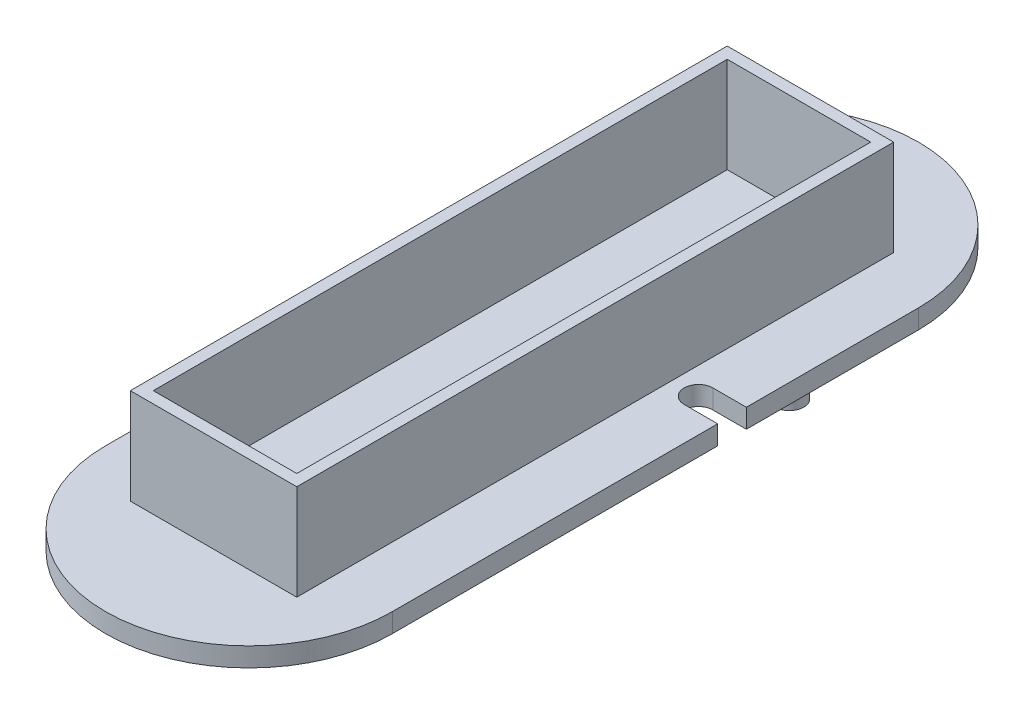
ISO-10303-21;
HEADER;
FILE_DESCRIPTION(('STEP AP214'),'2;1');
FILE_NAME('part.step','',(''),(''),'','','');
FILE_SCHEMA(('AUTOMOTIVE_DESIGN { 1 0 10303 214 1 1 1 1 }'));
ENDSEC;
DATA;
#1=APPLICATION_CONTEXT('core data for automotive mechanical design processes');
#2=APPLICATION_PROTOCOL_DEFINITION('international standard','automotive_design',2000,#1);
#3=PRODUCT_CONTEXT('',#1,'mechanical');
#4=PRODUCT('Part','Part','',(#3));
#5=PRODUCT_RELATED_PRODUCT_CATEGORY('part','',(#4));
#6=PRODUCT_DEFINITION_FORMATION('','',#4);
#7=PRODUCT_DEFINITION_CONTEXT('part definition',#1,'design');
#8=PRODUCT_DEFINITION('design','',#6,#7);
#9=PRODUCT_DEFINITION_SHAPE('','',#8);
#10=(LENGTH_UNIT() NAMED_UNIT(*) SI_UNIT(.MILLI.,.METRE.));
#11=(NAMED_UNIT(*) PLANE_ANGLE_UNIT() SI_UNIT($,.RADIAN.));
#12=(NAMED_UNIT(*) SI_UNIT($,.STERADIAN.) SOLID_ANGLE_UNIT());
#13=UNCERTAINTY_MEASURE_WITH_UNIT(LENGTH_MEASURE(1.E-05),#10,'distance_accuracy_value','');
#14=(GEOMETRIC_REPRESENTATION_CONTEXT(3) GLOBAL_UNCERTAINTY_ASSIGNED_CONTEXT((#13)) GLOBAL_UNIT_ASSIGNED_CONTEXT((#10,
#11,#12)) REPRESENTATION_CONTEXT('',''));
#15=CARTESIAN_POINT('',(0.,0.,0.));
#16=DIRECTION('',(0.,0.,1.));
#17=DIRECTION('',(1.,0.,0.));
#18=AXIS2_PLACEMENT_3D('',#15,#16,#17);
#19=CARTESIAN_POINT('',(0.,2.,-10.));
#20=DIRECTION('',(0.,1.,0.));
#21=DIRECTION('',(0.,0.,1.));
#22=AXIS2_PLACEMENT_3D('',#19,#20,#21);
#23=PLANE('',#22);
#24=CARTESIAN_POINT('',(0.,2.,-10.));
#25=DIRECTION('',(0.,1.,0.));
#26=DIRECTION('',(0.,0.,1.));
#27=AXIS2_PLACEMENT_3D('',#24,#25,#26);
#28=CIRCLE('',#27,15.);
#29=CARTESIAN_POINT('',(15.,2.,-10.));
#30=VERTEX_POINT('',#29);
#31=CARTESIAN_POINT('',(-15.,2.,-10.));
#32=VERTEX_POINT('',#31);
#33=EDGE_CURVE('E252',#30,#32,#28,.T.);
#34=ORIENTED_EDGE('',*,*,#33,.T.);
#35=DIRECTION('',(0.,0.,1.));
#36=VECTOR('',#35,1.);
#37=CARTESIAN_POINT('',(-15.,2.,-10.));
#38=LINE('',#37,#36);
#39=CARTESIAN_POINT('',(-15.,2.,8.));
#40=VERTEX_POINT('',#39);
#41=EDGE_CURVE('E255',#32,#40,#38,.T.);
#42=ORIENTED_EDGE('',*,*,#41,.T.);
#43=DIRECTION('',(1.,0.,0.));
#44=VECTOR('',#43,1.);
#45=CARTESIAN_POINT('',(-11.5,2.,8.));
#46=LINE('',#45,#44);
#47=CARTESIAN_POINT('',(-11.5,2.,8.));
#48=VERTEX_POINT('',#47);
#49=EDGE_CURVE('E258',#40,#48,#46,.T.);
#50=ORIENTED_EDGE('',*,*,#49,.T.);
#51=CARTESIAN_POINT('',(-11.5,2.,9.5));
#52=DIRECTION('',(0.,-1.,0.));
#53=DIRECTION('',(0.,0.,1.));
#54=AXIS2_PLACEMENT_3D('',#51,#52,#53);
#55=CIRCLE('',#54,1.5);
#56=CARTESIAN_POINT('',(-11.5,2.,11.));
#57=VERTEX_POINT('',#56);
#58=EDGE_CURVE('E260',#48,#57,#55,.T.);
#59=ORIENTED_EDGE('',*,*,#58,.T.);
#60=DIRECTION('',(-1.,0.,0.));
#61=VECTOR('',#60,1.);
#62=CARTESIAN_POINT('',(-11.5,2.,11.));
#63=LINE('',#62,#61);
#64=CARTESIAN_POINT('',(-15.,2.,11.));
#65=VERTEX_POINT('',#64);
#66=EDGE_CURVE('E262',#57,#65,#63,.T.);
#67=ORIENTED_EDGE('',*,*,#66,.T.);
#68=DIRECTION('',(0.,0.,1.));
#69=VECTOR('',#68,1.);
#70=CARTESIAN_POINT('',(-15.,2.,11.));
#71=LINE('',#70,#69);
#72=CARTESIAN_POINT('',(-15.,2.,45.));
#73=VERTEX_POINT('',#72);
#74=EDGE_CURVE('E264',#65,#73,#71,.T.);
#75=ORIENTED_EDGE('',*,*,#74,.T.);
#76=CARTESIAN_POINT('',(0.,2.,45.));
#77=DIRECTION('',(0.,1.,0.));
#78=DIRECTION('',(0.,0.,1.));
#79=AXIS2_PLACEMENT_3D('',#76,#77,#78);
#80=CIRCLE('',#79,15.);
#81=CARTESIAN_POINT('',(15.,2.,45.));
#82=VERTEX_POINT('',#81);
#83=EDGE_CURVE('E266',#73,#82,#80,.T.);
#84=ORIENTED_EDGE('',*,*,#83,.T.);
#85=DIRECTION('',(0.,0.,-1.));
#86=VECTOR('',#85,1.);
#87=CARTESIAN_POINT('',(15.,2.,11.));
#88=LINE('',#87,#86);
#89=CARTESIAN_POINT('',(15.,2.,11.));
#90=VERTEX_POINT('',#89);
#91=EDGE_CURVE('E268',#82,#90,#88,.T.);
#92=ORIENTED_EDGE('',*,*,#91,.T.);
#93=DIRECTION('',(-1.,0.,0.));
#94=VECTOR('',#93,1.);
#95=CARTESIAN_POINT('',(11.5,2.,11.));
#96=LINE('',#95,#94);
#97=CARTESIAN_POINT('',(11.5,2.,11.));
#98=VERTEX_POINT('',#97);
#99=EDGE_CURVE('E270',#90,#98,#96,.T.);
#100=ORIENTED_EDGE('',*,*,#99,.T.);
#101=CARTESIAN_POINT('',(11.5,2.,9.5));
#102=DIRECTION('',(0.,-1.,0.));
#103=DIRECTION('',(0.,0.,1.));
#104=AXIS2_PLACEMENT_3D('',#101,#102,#103);
#105=CIRCLE('',#104,1.5);
#106=CARTESIAN_POINT('',(11.5,2.,8.));
#107=VERTEX_POINT('',#106);
#108=EDGE_CURVE('E272',#98,#107,#105,.T.);
#109=ORIENTED_EDGE('',*,*,#108,.T.);
#110=DIRECTION('',(1.,0.,0.));
#111=VECTOR('',#110,1.);
#112=CARTESIAN_POINT('',(15.,2.,8.));
#113=LINE('',#112,#111);
#114=CARTESIAN_POINT('',(15.,2.,8.));
#115=VERTEX_POINT('',#114);
#116=EDGE_CURVE('E274',#107,#115,#113,.T.);
#117=ORIENTED_EDGE('',*,*,#116,.T.);
#118=DIRECTION('',(0.,0.,-1.));
#119=VECTOR('',#118,1.);
#120=CARTESIAN_POINT('',(15.,2.,-10.));
#121=LINE('',#120,#119);
#122=EDGE_CURVE('E276',#115,#30,#121,.T.);
#123=ORIENTED_EDGE('',*,*,#122,.T.);
#124=EDGE_LOOP('',(#34,#42,#50,#59,#67,#75,#84,#92,#100,#109,#117,#123));
#125=FACE_BOUND('',#124,.T.);
#126=DIRECTION('',(1.,0.,0.));
#127=VECTOR('',#126,1.);
#128=CARTESIAN_POINT('',(-8.7,2.,48.7));
#129=LINE('',#128,#127);
#130=CARTESIAN_POINT('',(-8.7,2.,48.7));
#131=VERTEX_POINT('',#130);
#132=CARTESIAN_POINT('',(8.7,2.,48.7));
#133=VERTEX_POINT('',#132);
#134=EDGE_CURVE('E232',#131,#133,#129,.T.);
#135=ORIENTED_EDGE('',*,*,#134,.F.);
#136=DIRECTION('',(0.,0.,1.));
#137=VECTOR('',#136,1.);
#138=CARTESIAN_POINT('',(-8.7,2.,48.7));
#139=LINE('',#138,#137);
#140=CARTESIAN_POINT('',(-8.7,2.,-13.7));
#141=VERTEX_POINT('',#140);
#142=EDGE_CURVE('E197',#141,#131,#139,.T.);
#143=ORIENTED_EDGE('',*,*,#142,.F.);
#144=DIRECTION('',(-1.,0.,0.));
#145=VECTOR('',#144,1.);
#146=CARTESIAN_POINT('',(-8.7,2.,-13.7));
#147=LINE('',#146,#145);
#148=CARTESIAN_POINT('',(8.7,2.,-13.7));
#149=VERTEX_POINT('',#148);
#150=EDGE_CURVE('E223',#149,#141,#147,.T.);
#151=ORIENTED_EDGE('',*,*,#150,.F.);
#152=DIRECTION('',(0.,0.,-1.));
#153=VECTOR('',#152,1.);
#154=CARTESIAN_POINT('',(8.7,2.,48.7));
#155=LINE('',#154,#153);
#156=EDGE_CURVE('E234',#133,#149,#155,.T.);
#157=ORIENTED_EDGE('',*,*,#156,.F.);
#158=EDGE_LOOP('',(#135,#143,#151,#157));
#159=FACE_BOUND('',#158,.T.);
#160=ADVANCED_FACE('F41',(#125,#159),#23,.T.);
#161=CARTESIAN_POINT('',(0.,2.,-10.));
#162=DIRECTION('',(0.,-1.,0.));
#163=DIRECTION('',(0.,0.,-1.));
#164=AXIS2_PLACEMENT_3D('',#161,#162,#163);
#165=CYLINDRICAL_SURFACE('',#164,15.);
#166=CARTESIAN_POINT('',(0.,0.,-10.));
#167=DIRECTION('',(0.,1.,0.));
#168=DIRECTION('',(0.,0.,1.));
#169=AXIS2_PLACEMENT_3D('',#166,#167,#168);
#170=CIRCLE('',#169,15.);
#171=CARTESIAN_POINT('',(15.,0.,-10.));
#172=VERTEX_POINT('',#171);
#173=CARTESIAN_POINT('',(-15.,0.,-10.));
#174=VERTEX_POINT('',#173);
#175=EDGE_CURVE('E251',#172,#174,#170,.T.);
#176=ORIENTED_EDGE('',*,*,#175,.T.);
#177=DIRECTION('',(0.,-1.,0.));
#178=VECTOR('',#177,1.);
#179=CARTESIAN_POINT('',(-15.,2.,-10.));
#180=LINE('',#179,#178);
#181=EDGE_CURVE('E334',#32,#174,#180,.T.);
#182=ORIENTED_EDGE('',*,*,#181,.F.);
#183=ORIENTED_EDGE('',*,*,#33,.F.);
#184=DIRECTION('',(0.,-1.,0.));
#185=VECTOR('',#184,1.);
#186=CARTESIAN_POINT('',(15.,2.,-10.));
#187=LINE('',#186,#185);
#188=EDGE_CURVE('E278',#30,#172,#187,.T.);
#189=ORIENTED_EDGE('',*,*,#188,.T.);
#190=EDGE_LOOP('',(#176,#182,#183,#189));
#191=FACE_BOUND('',#190,.T.);
#192=ADVANCED_FACE('F43',(#191),#165,.T.);
#193=CARTESIAN_POINT('',(-15.,2.,-10.));
#194=DIRECTION('',(1.,0.,0.));
#195=DIRECTION('',(0.,0.,-1.));
#196=AXIS2_PLACEMENT_3D('',#193,#194,#195);
#197=PLANE('',#196);
#198=DIRECTION('',(0.,0.,1.));
#199=VECTOR('',#198,1.);
#200=CARTESIAN_POINT('',(-15.,0.,-10.));
#201=LINE('',#200,#199);
#202=CARTESIAN_POINT('',(-15.,0.,8.));
#203=VERTEX_POINT('',#202);
#204=EDGE_CURVE('E281',#174,#203,#201,.T.);
#205=ORIENTED_EDGE('',*,*,#204,.T.);
#206=DIRECTION('',(0.,-1.,0.));
#207=VECTOR('',#206,1.);
#208=CARTESIAN_POINT('',(-15.,2.,8.));
#209=LINE('',#208,#207);
#210=EDGE_CURVE('E331',#40,#203,#209,.T.);
#211=ORIENTED_EDGE('',*,*,#210,.F.);
#212=ORIENTED_EDGE('',*,*,#41,.F.);
#213=ORIENTED_EDGE('',*,*,#181,.T.);
#214=EDGE_LOOP('',(#205,#211,#212,#213));
#215=FACE_BOUND('',#214,.T.);
#216=ADVANCED_FACE('F402',(#215),#197,.F.);
#217=CARTESIAN_POINT('',(-11.5,2.,8.));
#218=DIRECTION('',(0.,0.,-1.));
#219=DIRECTION('',(-1.,0.,0.));
#220=AXIS2_PLACEMENT_3D('',#217,#218,#219);
#221=PLANE('',#220);
#222=DIRECTION('',(1.,0.,0.));
#223=VECTOR('',#222,1.);
#224=CARTESIAN_POINT('',(-11.5,0.,8.));
#225=LINE('',#224,#223);
#226=CARTESIAN_POINT('',(-11.5,0.,8.));
#227=VERTEX_POINT('',#226);
#228=EDGE_CURVE('E283',#203,#227,#225,.T.);
#229=ORIENTED_EDGE('',*,*,#228,.T.);
#230=DIRECTION('',(0.,-1.,0.));
#231=VECTOR('',#230,1.);
#232=CARTESIAN_POINT('',(-11.5,2.,8.));
#233=LINE('',#232,#231);
#234=EDGE_CURVE('E328',#48,#227,#233,.T.);
#235=ORIENTED_EDGE('',*,*,#234,.F.);
#236=ORIENTED_EDGE('',*,*,#49,.F.);
#237=ORIENTED_EDGE('',*,*,#210,.T.);
#238=EDGE_LOOP('',(#229,#235,#236,#237));
#239=FACE_BOUND('',#238,.T.);
#240=ADVANCED_FACE('F399',(#239),#221,.F.);
#241=CARTESIAN_POINT('',(-11.5,2.,9.5));
#242=DIRECTION('',(0.,-1.,0.));
#243=DIRECTION('',(0.,0.,-1.));
#244=AXIS2_PLACEMENT_3D('',#241,#242,#243);
#245=CYLINDRICAL_SURFACE('',#244,1.5);
#246=CARTESIAN_POINT('',(-11.5,0.,9.5));
#247=DIRECTION('',(0.,-1.,0.));
#248=DIRECTION('',(0.,0.,1.));
#249=AXIS2_PLACEMENT_3D('',#246,#247,#248);
#250=CIRCLE('',#249,1.5);
#251=CARTESIAN_POINT('',(-11.5,0.,11.));
#252=VERTEX_POINT('',#251);
#253=EDGE_CURVE('E285',#227,#252,#250,.T.);
#254=ORIENTED_EDGE('',*,*,#253,.T.);
#255=DIRECTION('',(0.,-1.,0.));
#256=VECTOR('',#255,1.);
#257=CARTESIAN_POINT('',(-11.5,2.,11.));
#258=LINE('',#257,#256);
#259=EDGE_CURVE('E325',#57,#252,#258,.T.);
#260=ORIENTED_EDGE('',*,*,#259,.F.);
#261=ORIENTED_EDGE('',*,*,#58,.F.);
#262=ORIENTED_EDGE('',*,*,#234,.T.);
#263=EDGE_LOOP('',(#254,#260,#261,#262));
#264=FACE_BOUND('',#263,.T.);
#265=ADVANCED_FACE('F394',(#264),#245,.F.);
#266=CARTESIAN_POINT('',(-11.5,2.,11.));
#267=DIRECTION('',(0.,0.,1.));
#268=DIRECTION('',(1.,0.,0.));
#269=AXIS2_PLACEMENT_3D('',#266,#267,#268);
#270=PLANE('',#269);
#271=DIRECTION('',(-1.,0.,0.));
#272=VECTOR('',#271,1.);
#273=CARTESIAN_POINT('',(-11.5,0.,11.));
#274=LINE('',#273,#272);
#275=CARTESIAN_POINT('',(-15.,0.,11.));
#276=VERTEX_POINT('',#275);
#277=EDGE_CURVE('E287',#252,#276,#274,.T.);
#278=ORIENTED_EDGE('',*,*,#277,.T.);
#279=DIRECTION('',(0.,-1.,0.));
#280=VECTOR('',#279,1.);
#281=CARTESIAN_POINT('',(-15.,2.,11.));
#282=LINE('',#281,#280);
#283=EDGE_CURVE('E322',#65,#276,#282,.T.);
#284=ORIENTED_EDGE('',*,*,#283,.F.);
#285=ORIENTED_EDGE('',*,*,#66,.F.);
#286=ORIENTED_EDGE('',*,*,#259,.T.);
#287=EDGE_LOOP('',(#278,#284,#285,#286));
#288=FACE_BOUND('',#287,.T.);
#289=ADVANCED_FACE('F390',(#288),#270,.F.);
#290=CARTESIAN_POINT('',(-15.,2.,11.));
#291=DIRECTION('',(1.,0.,0.));
#292=DIRECTION('',(0.,0.,-1.));
#293=AXIS2_PLACEMENT_3D('',#290,#291,#292);
#294=PLANE('',#293);
#295=DIRECTION('',(0.,0.,1.));
#296=VECTOR('',#295,1.);
#297=CARTESIAN_POINT('',(-15.,0.,11.));
#298=LINE('',#297,#296);
#299=CARTESIAN_POINT('',(-15.,0.,45.));
#300=VERTEX_POINT('',#299);
#301=EDGE_CURVE('E289',#276,#300,#298,.T.);
#302=ORIENTED_EDGE('',*,*,#301,.T.);
#303=DIRECTION('',(0.,-1.,0.));
#304=VECTOR('',#303,1.);
#305=CARTESIAN_POINT('',(-15.,2.,45.));
#306=LINE('',#305,#304);
#307=EDGE_CURVE('E319',#73,#300,#306,.T.);
#308=ORIENTED_EDGE('',*,*,#307,.F.);
#309=ORIENTED_EDGE('',*,*,#74,.F.);
#310=ORIENTED_EDGE('',*,*,#283,.T.);
#311=EDGE_LOOP('',(#302,#308,#309,#310));
#312=FACE_BOUND('',#311,.T.);
#313=ADVANCED_FACE('F386',(#312),#294,.F.);
#314=CARTESIAN_POINT('',(0.,2.,45.));
#315=DIRECTION('',(0.,-1.,0.));
#316=DIRECTION('',(0.,0.,-1.));
#317=AXIS2_PLACEMENT_3D('',#314,#315,#316);
#318=CYLINDRICAL_SURFACE('',#317,15.);
#319=CARTESIAN_POINT('',(0.,0.,45.));
#320=DIRECTION('',(0.,1.,0.));
#321=DIRECTION('',(0.,0.,1.));
#322=AXIS2_PLACEMENT_3D('',#319,#320,#321);
#323=CIRCLE('',#322,15.);
#324=CARTESIAN_POINT('',(15.,0.,45.));
#325=VERTEX_POINT('',#324);
#326=EDGE_CURVE('E291',#300,#325,#323,.T.);
#327=ORIENTED_EDGE('',*,*,#326,.T.);
#328=DIRECTION('',(0.,-1.,0.));
#329=VECTOR('',#328,1.);
#330=CARTESIAN_POINT('',(15.,2.,45.));
#331=LINE('',#330,#329);
#332=EDGE_CURVE('E316',#82,#325,#331,.T.);
#333=ORIENTED_EDGE('',*,*,#332,.F.);
#334=ORIENTED_EDGE('',*,*,#83,.F.);
#335=ORIENTED_EDGE('',*,*,#307,.T.);
#336=EDGE_LOOP('',(#327,#333,#334,#335));
#337=FACE_BOUND('',#336,.T.);
#338=ADVANCED_FACE('F381',(#337),#318,.T.);
#339=CARTESIAN_POINT('',(15.,2.,11.));
#340=DIRECTION('',(-1.,0.,0.));
#341=DIRECTION('',(0.,0.,1.));
#342=AXIS2_PLACEMENT_3D('',#339,#340,#341);
#343=PLANE('',#342);
#344=DIRECTION('',(0.,0.,-1.));
#345=VECTOR('',#344,1.);
#346=CARTESIAN_POINT('',(15.,0.,11.));
#347=LINE('',#346,#345);
#348=CARTESIAN_POINT('',(15.,0.,11.));
#349=VERTEX_POINT('',#348);
#350=EDGE_CURVE('E293',#325,#349,#347,.T.);
#351=ORIENTED_EDGE('',*,*,#350,.T.);
#352=DIRECTION('',(0.,-1.,0.));
#353=VECTOR('',#352,1.);
#354=CARTESIAN_POINT('',(15.,2.,11.));
#355=LINE('',#354,#353);
#356=EDGE_CURVE('E313',#90,#349,#355,.T.);
#357=ORIENTED_EDGE('',*,*,#356,.F.);
#358=ORIENTED_EDGE('',*,*,#91,.F.);
#359=ORIENTED_EDGE('',*,*,#332,.T.);
#360=EDGE_LOOP('',(#351,#357,#358,#359));
#361=FACE_BOUND('',#360,.T.);
#362=ADVANCED_FACE('F375',(#361),#343,.F.);
#363=CARTESIAN_POINT('',(11.5,2.,11.));
#364=DIRECTION('',(0.,0.,1.));
#365=DIRECTION('',(1.,0.,0.));
#366=AXIS2_PLACEMENT_3D('',#363,#364,#365);
#367=PLANE('',#366);
#368=DIRECTION('',(-1.,0.,0.));
#369=VECTOR('',#368,1.);
#370=CARTESIAN_POINT('',(11.5,0.,11.));
#371=LINE('',#370,#369);
#372=CARTESIAN_POINT('',(11.5,0.,11.));
#373=VERTEX_POINT('',#372);
#374=EDGE_CURVE('E295',#349,#373,#371,.T.);
#375=ORIENTED_EDGE('',*,*,#374,.T.);
#376=DIRECTION('',(0.,-1.,0.));
#377=VECTOR('',#376,1.);
#378=CARTESIAN_POINT('',(11.5,2.,11.));
#379=LINE('',#378,#377);
#380=EDGE_CURVE('E310',#98,#373,#379,.T.);
#381=ORIENTED_EDGE('',*,*,#380,.F.);
#382=ORIENTED_EDGE('',*,*,#99,.F.);
#383=ORIENTED_EDGE('',*,*,#356,.T.);
#384=EDGE_LOOP('',(#375,#381,#382,#383));
#385=FACE_BOUND('',#384,.T.);
#386=ADVANCED_FACE('F371',(#385),#367,.F.);
#387=CARTESIAN_POINT('',(11.5,2.,9.5));
#388=DIRECTION('',(0.,-1.,0.));
#389=DIRECTION('',(0.,0.,-1.));
#390=AXIS2_PLACEMENT_3D('',#387,#388,#389);
#391=CYLINDRICAL_SURFACE('',#390,1.5);
#392=CARTESIAN_POINT('',(11.5,0.,9.5));
#393=DIRECTION('',(0.,-1.,0.));
#394=DIRECTION('',(0.,0.,1.));
#395=AXIS2_PLACEMENT_3D('',#392,#393,#394);
#396=CIRCLE('',#395,1.5);
#397=CARTESIAN_POINT('',(11.5,0.,8.));
#398=VERTEX_POINT('',#397);
#399=EDGE_CURVE('E297',#373,#398,#396,.T.);
#400=ORIENTED_EDGE('',*,*,#399,.T.);
#401=DIRECTION('',(0.,-1.,0.));
#402=VECTOR('',#401,1.);
#403=CARTESIAN_POINT('',(11.5,2.,8.));
#404=LINE('',#403,#402);
#405=EDGE_CURVE('E307',#107,#398,#404,.T.);
#406=ORIENTED_EDGE('',*,*,#405,.F.);
#407=ORIENTED_EDGE('',*,*,#108,.F.);
#408=ORIENTED_EDGE('',*,*,#380,.T.);
#409=EDGE_LOOP('',(#400,#406,#407,#408));
#410=FACE_BOUND('',#409,.T.);
#411=ADVANCED_FACE('F366',(#410),#391,.F.);
#412=CARTESIAN_POINT('',(15.,2.,8.));
#413=DIRECTION('',(0.,0.,-1.));
#414=DIRECTION('',(-1.,0.,0.));
#415=AXIS2_PLACEMENT_3D('',#412,#413,#414);
#416=PLANE('',#415);
#417=DIRECTION('',(1.,0.,0.));
#418=VECTOR('',#417,1.);
#419=CARTESIAN_POINT('',(15.,0.,8.));
#420=LINE('',#419,#418);
#421=CARTESIAN_POINT('',(15.,0.,8.));
#422=VERTEX_POINT('',#421);
#423=EDGE_CURVE('E299',#398,#422,#420,.T.);
#424=ORIENTED_EDGE('',*,*,#423,.T.);
#425=DIRECTION('',(0.,-1.,0.));
#426=VECTOR('',#425,1.);
#427=CARTESIAN_POINT('',(15.,2.,8.));
#428=LINE('',#427,#426);
#429=EDGE_CURVE('E304',#115,#422,#428,.T.);
#430=ORIENTED_EDGE('',*,*,#429,.F.);
#431=ORIENTED_EDGE('',*,*,#116,.F.);
#432=ORIENTED_EDGE('',*,*,#405,.T.);
#433=EDGE_LOOP('',(#424,#430,#431,#432));
#434=FACE_BOUND('',#433,.T.);
#435=ADVANCED_FACE('F360',(#434),#416,.F.);
#436=CARTESIAN_POINT('',(15.,2.,-10.));
#437=DIRECTION('',(-1.,0.,0.));
#438=DIRECTION('',(0.,0.,1.));
#439=AXIS2_PLACEMENT_3D('',#436,#437,#438);
#440=PLANE('',#439);
#441=DIRECTION('',(0.,0.,-1.));
#442=VECTOR('',#441,1.);
#443=CARTESIAN_POINT('',(15.,0.,-10.));
#444=LINE('',#443,#442);
#445=EDGE_CURVE('E256',#422,#172,#444,.T.);
#446=ORIENTED_EDGE('',*,*,#445,.T.);
#447=ORIENTED_EDGE('',*,*,#188,.F.);
#448=ORIENTED_EDGE('',*,*,#122,.F.);
#449=ORIENTED_EDGE('',*,*,#429,.T.);
#450=EDGE_LOOP('',(#446,#447,#448,#449));
#451=FACE_BOUND('',#450,.T.);
#452=ADVANCED_FACE('F344',(#451),#440,.F.);
#453=CARTESIAN_POINT('',(0.,0.,-10.));
#454=DIRECTION('',(0.,1.,0.));
#455=DIRECTION('',(0.,0.,1.));
#456=AXIS2_PLACEMENT_3D('',#453,#454,#455);
#457=PLANE('',#456);
#458=CARTESIAN_POINT('',(-11.5,0.,0.));
#459=DIRECTION('',(0.,1.,0.));
#460=DIRECTION('',(0.,0.,1.));
#461=AXIS2_PLACEMENT_3D('',#458,#459,#460);
#462=CIRCLE('',#461,1.5);
#463=CARTESIAN_POINT('',(-11.5,0.,1.5));
#464=VERTEX_POINT('',#463);
#465=EDGE_CURVE('E11',#464,#464,#462,.F.);
#466=ORIENTED_EDGE('',*,*,#465,.F.);
#467=EDGE_LOOP('',(#466));
#468=FACE_BOUND('',#467,.T.);
#469=CARTESIAN_POINT('',(11.5,0.,0.));
#470=DIRECTION('',(0.,1.,0.));
#471=DIRECTION('',(0.,0.,1.));
#472=AXIS2_PLACEMENT_3D('',#469,#470,#471);
#473=CIRCLE('',#472,1.5);
#474=CARTESIAN_POINT('',(11.5,0.,1.5));
#475=VERTEX_POINT('',#474);
#476=EDGE_CURVE('E49',#475,#475,#473,.F.);
#477=ORIENTED_EDGE('',*,*,#476,.F.);
#478=EDGE_LOOP('',(#477));
#479=FACE_BOUND('',#478,.T.);
#480=ORIENTED_EDGE('',*,*,#175,.F.);
#481=ORIENTED_EDGE('',*,*,#445,.F.);
#482=ORIENTED_EDGE('',*,*,#423,.F.);
#483=ORIENTED_EDGE('',*,*,#399,.F.);
#484=ORIENTED_EDGE('',*,*,#374,.F.);
#485=ORIENTED_EDGE('',*,*,#350,.F.);
#486=ORIENTED_EDGE('',*,*,#326,.F.);
#487=ORIENTED_EDGE('',*,*,#301,.F.);
#488=ORIENTED_EDGE('',*,*,#277,.F.);
#489=ORIENTED_EDGE('',*,*,#253,.F.);
#490=ORIENTED_EDGE('',*,*,#228,.F.);
#491=ORIENTED_EDGE('',*,*,#204,.F.);
#492=EDGE_LOOP('',(#480,#481,#482,#483,#484,#485,#486,#487,#488,#489,#490,#491));
#493=FACE_BOUND('',#492,.T.);
#494=ADVANCED_FACE('F341',(#468,#479,#493),#457,.F.);
#495=CARTESIAN_POINT('',(11.5,-3.,0.));
#496=DIRECTION('',(0.,1.,0.));
#497=DIRECTION('',(0.,0.,1.));
#498=AXIS2_PLACEMENT_3D('',#495,#496,#497);
#499=CYLINDRICAL_SURFACE('',#498,1.5);
#500=CARTESIAN_POINT('',(11.5,-3.,0.));
#501=DIRECTION('',(0.,-1.,0.));
#502=DIRECTION('',(0.,0.,-1.));
#503=AXIS2_PLACEMENT_3D('',#500,#501,#502);
#504=CIRCLE('',#503,1.5);
#505=CARTESIAN_POINT('',(11.5,-3.,-1.5));
#506=VERTEX_POINT('',#505);
#507=EDGE_CURVE('E248',#506,#506,#504,.T.);
#508=ORIENTED_EDGE('',*,*,#507,.F.);
#509=EDGE_LOOP('',(#508));
#510=FACE_BOUND('',#509,.T.);
#511=ORIENTED_EDGE('',*,*,#476,.T.);
#512=EDGE_LOOP('',(#511));
#513=FACE_BOUND('',#512,.T.);
#514=ADVANCED_FACE('F339',(#510,#513),#499,.T.);
#515=CARTESIAN_POINT('',(11.5,-3.,0.));
#516=DIRECTION('',(0.,-1.,0.));
#517=DIRECTION('',(0.,0.,-1.));
#518=AXIS2_PLACEMENT_3D('',#515,#516,#517);
#519=PLANE('',#518);
#520=ORIENTED_EDGE('',*,*,#507,.T.);
#521=EDGE_LOOP('',(#520));
#522=FACE_BOUND('',#521,.T.);
#523=ADVANCED_FACE('F443',(#522),#519,.T.);
#524=CARTESIAN_POINT('',(-11.5,-3.,0.));
#525=DIRECTION('',(0.,1.,0.));
#526=DIRECTION('',(0.,0.,1.));
#527=AXIS2_PLACEMENT_3D('',#524,#525,#526);
#528=CYLINDRICAL_SURFACE('',#527,1.5);
#529=CARTESIAN_POINT('',(-11.5,-3.,0.));
#530=DIRECTION('',(0.,-1.,0.));
#531=DIRECTION('',(0.,0.,-1.));
#532=AXIS2_PLACEMENT_3D('',#529,#530,#531);
#533=CIRCLE('',#532,1.5);
#534=CARTESIAN_POINT('',(-11.5,-3.,-1.5));
#535=VERTEX_POINT('',#534);
#536=EDGE_CURVE('E245',#535,#535,#533,.T.);
#537=ORIENTED_EDGE('',*,*,#536,.F.);
#538=EDGE_LOOP('',(#537));
#539=FACE_BOUND('',#538,.T.);
#540=ORIENTED_EDGE('',*,*,#465,.T.);
#541=EDGE_LOOP('',(#540));
#542=FACE_BOUND('',#541,.T.);
#543=ADVANCED_FACE('F439',(#539,#542),#528,.T.);
#544=CARTESIAN_POINT('',(-11.5,-3.,0.));
#545=DIRECTION('',(0.,-1.,0.));
#546=DIRECTION('',(0.,0.,-1.));
#547=AXIS2_PLACEMENT_3D('',#544,#545,#546);
#548=PLANE('',#547);
#549=ORIENTED_EDGE('',*,*,#536,.T.);
#550=EDGE_LOOP('',(#549));
#551=FACE_BOUND('',#550,.T.);
#552=ADVANCED_FACE('F442',(#551),#548,.T.);
#553=CARTESIAN_POINT('',(0.,12.,0.));
#554=DIRECTION('',(0.,-1.,0.));
#555=DIRECTION('',(0.,0.,-1.));
#556=AXIS2_PLACEMENT_3D('',#553,#554,#555);
#557=PLANE('',#556);
#558=DIRECTION('',(0.,0.,1.));
#559=VECTOR('',#558,1.);
#560=CARTESIAN_POINT('',(-8.7,12.,48.7));
#561=LINE('',#560,#559);
#562=CARTESIAN_POINT('',(-8.7,12.,-13.7));
#563=VERTEX_POINT('',#562);
#564=CARTESIAN_POINT('',(-8.7,12.,48.7));
#565=VERTEX_POINT('',#564);
#566=EDGE_CURVE('E219',#563,#565,#561,.T.);
#567=ORIENTED_EDGE('',*,*,#566,.T.);
#568=DIRECTION('',(1.,0.,0.));
#569=VECTOR('',#568,1.);
#570=CARTESIAN_POINT('',(-8.7,12.,48.7));
#571=LINE('',#570,#569);
#572=CARTESIAN_POINT('',(8.7,12.,48.7));
#573=VERTEX_POINT('',#572);
#574=EDGE_CURVE('E222',#565,#573,#571,.T.);
#575=ORIENTED_EDGE('',*,*,#574,.T.);
#576=DIRECTION('',(0.,0.,-1.));
#577=VECTOR('',#576,1.);
#578=CARTESIAN_POINT('',(8.7,12.,48.7));
#579=LINE('',#578,#577);
#580=CARTESIAN_POINT('',(8.7,12.,-13.7));
#581=VERTEX_POINT('',#580);
#582=EDGE_CURVE('E225',#573,#581,#579,.T.);
#583=ORIENTED_EDGE('',*,*,#582,.T.);
#584=DIRECTION('',(-1.,0.,0.));
#585=VECTOR('',#584,1.);
#586=CARTESIAN_POINT('',(-8.7,12.,-13.7));
#587=LINE('',#586,#585);
#588=EDGE_CURVE('E227',#581,#563,#587,.T.);
#589=ORIENTED_EDGE('',*,*,#588,.T.);
#590=EDGE_LOOP('',(#567,#575,#583,#589));
#591=FACE_BOUND('',#590,.T.);
#592=DIRECTION('',(0.,0.,-1.));
#593=VECTOR('',#592,1.);
#594=CARTESIAN_POINT('',(7.5,12.,47.5));
#595=LINE('',#594,#593);
#596=CARTESIAN_POINT('',(7.5,12.,47.5));
#597=VERTEX_POINT('',#596);
#598=CARTESIAN_POINT('',(7.5,12.,-12.5));
#599=VERTEX_POINT('',#598);
#600=EDGE_CURVE('E180',#597,#599,#595,.T.);
#601=ORIENTED_EDGE('',*,*,#600,.F.);
#602=DIRECTION('',(1.,0.,0.));
#603=VECTOR('',#602,1.);
#604=CARTESIAN_POINT('',(-7.5,12.,47.5));
#605=LINE('',#604,#603);
#606=CARTESIAN_POINT('',(-7.5,12.,47.5));
#607=VERTEX_POINT('',#606);
#608=EDGE_CURVE('E205',#607,#597,#605,.T.);
#609=ORIENTED_EDGE('',*,*,#608,.F.);
#610=DIRECTION('',(0.,0.,1.));
#611=VECTOR('',#610,1.);
#612=CARTESIAN_POINT('',(-7.5,12.,47.5));
#613=LINE('',#612,#611);
#614=CARTESIAN_POINT('',(-7.5,12.,-12.5));
#615=VERTEX_POINT('',#614);
#616=EDGE_CURVE('E203',#615,#607,#613,.T.);
#617=ORIENTED_EDGE('',*,*,#616,.F.);
#618=DIRECTION('',(-1.,0.,0.));
#619=VECTOR('',#618,1.);
#620=CARTESIAN_POINT('',(-7.5,12.,-12.5));
#621=LINE('',#620,#619);
#622=EDGE_CURVE('E189',#599,#615,#621,.T.);
#623=ORIENTED_EDGE('',*,*,#622,.F.);
#624=EDGE_LOOP('',(#601,#609,#617,#623));
#625=FACE_BOUND('',#624,.T.);
#626=ADVANCED_FACE('F201',(#591,#625),#557,.F.);
#627=CARTESIAN_POINT('',(-8.7,12.,48.7));
#628=DIRECTION('',(1.,0.,0.));
#629=DIRECTION('',(0.,0.,-1.));
#630=AXIS2_PLACEMENT_3D('',#627,#628,#629);
#631=PLANE('',#630);
#632=ORIENTED_EDGE('',*,*,#142,.T.);
#633=DIRECTION('',(0.,-1.,0.));
#634=VECTOR('',#633,1.);
#635=CARTESIAN_POINT('',(-8.7,12.,48.7));
#636=LINE('',#635,#634);
#637=EDGE_CURVE('E243',#565,#131,#636,.T.);
#638=ORIENTED_EDGE('',*,*,#637,.F.);
#639=ORIENTED_EDGE('',*,*,#566,.F.);
#640=DIRECTION('',(0.,-1.,0.));
#641=VECTOR('',#640,1.);
#642=CARTESIAN_POINT('',(-8.7,12.,-13.7));
#643=LINE('',#642,#641);
#644=EDGE_CURVE('E229',#563,#141,#643,.T.);
#645=ORIENTED_EDGE('',*,*,#644,.T.);
#646=EDGE_LOOP('',(#632,#638,#639,#645));
#647=FACE_BOUND('',#646,.T.);
#648=ADVANCED_FACE('F423',(#647),#631,.F.);
#649=CARTESIAN_POINT('',(-8.7,12.,48.7));
#650=DIRECTION('',(0.,0.,-1.));
#651=DIRECTION('',(-1.,0.,0.));
#652=AXIS2_PLACEMENT_3D('',#649,#650,#651);
#653=PLANE('',#652);
#654=ORIENTED_EDGE('',*,*,#134,.T.);
#655=DIRECTION('',(0.,-1.,0.));
#656=VECTOR('',#655,1.);
#657=CARTESIAN_POINT('',(8.7,12.,48.7));
#658=LINE('',#657,#656);
#659=EDGE_CURVE('E240',#573,#133,#658,.T.);
#660=ORIENTED_EDGE('',*,*,#659,.F.);
#661=ORIENTED_EDGE('',*,*,#574,.F.);
#662=ORIENTED_EDGE('',*,*,#637,.T.);
#663=EDGE_LOOP('',(#654,#660,#661,#662));
#664=FACE_BOUND('',#663,.T.);
#665=ADVANCED_FACE('F414',(#664),#653,.F.);
#666=CARTESIAN_POINT('',(8.7,12.,48.7));
#667=DIRECTION('',(-1.,0.,0.));
#668=DIRECTION('',(0.,0.,1.));
#669=AXIS2_PLACEMENT_3D('',#666,#667,#668);
#670=PLANE('',#669);
#671=ORIENTED_EDGE('',*,*,#156,.T.);
#672=DIRECTION('',(0.,-1.,0.));
#673=VECTOR('',#672,1.);
#674=CARTESIAN_POINT('',(8.7,12.,-13.7));
#675=LINE('',#674,#673);
#676=EDGE_CURVE('E56',#581,#149,#675,.T.);
#677=ORIENTED_EDGE('',*,*,#676,.F.);
#678=ORIENTED_EDGE('',*,*,#582,.F.);
#679=ORIENTED_EDGE('',*,*,#659,.T.);
#680=EDGE_LOOP('',(#671,#677,#678,#679));
#681=FACE_BOUND('',#680,.T.);
#682=ADVANCED_FACE('F418',(#681),#670,.F.);
#683=CARTESIAN_POINT('',(-8.7,12.,-13.7));
#684=DIRECTION('',(0.,0.,1.));
#685=DIRECTION('',(1.,0.,0.));
#686=AXIS2_PLACEMENT_3D('',#683,#684,#685);
#687=PLANE('',#686);
#688=ORIENTED_EDGE('',*,*,#150,.T.);
#689=ORIENTED_EDGE('',*,*,#644,.F.);
#690=ORIENTED_EDGE('',*,*,#588,.F.);
#691=ORIENTED_EDGE('',*,*,#676,.T.);
#692=EDGE_LOOP('',(#688,#689,#690,#691));
#693=FACE_BOUND('',#692,.T.);
#694=ADVANCED_FACE('F424',(#693),#687,.F.);
#695=CARTESIAN_POINT('',(7.5,12.,47.5));
#696=DIRECTION('',(-1.,0.,0.));
#697=DIRECTION('',(0.,0.,1.));
#698=AXIS2_PLACEMENT_3D('',#695,#696,#697);
#699=PLANE('',#698);
#700=DIRECTION('',(0.,0.,-1.));
#701=VECTOR('',#700,1.);
#702=CARTESIAN_POINT('',(7.5,2.,47.5));
#703=LINE('',#702,#701);
#704=CARTESIAN_POINT('',(7.5,2.,47.5));
#705=VERTEX_POINT('',#704);
#706=CARTESIAN_POINT('',(7.5,2.,-12.5));
#707=VERTEX_POINT('',#706);
#708=EDGE_CURVE('E64',#705,#707,#703,.T.);
#709=ORIENTED_EDGE('',*,*,#708,.F.);
#710=DIRECTION('',(0.,-1.,0.));
#711=VECTOR('',#710,1.);
#712=CARTESIAN_POINT('',(7.5,12.,47.5));
#713=LINE('',#712,#711);
#714=EDGE_CURVE('E185',#597,#705,#713,.T.);
#715=ORIENTED_EDGE('',*,*,#714,.F.);
#716=ORIENTED_EDGE('',*,*,#600,.T.);
#717=DIRECTION('',(0.,-1.,0.));
#718=VECTOR('',#717,1.);
#719=CARTESIAN_POINT('',(7.5,12.,-12.5));
#720=LINE('',#719,#718);
#721=EDGE_CURVE('E183',#599,#707,#720,.T.);
#722=ORIENTED_EDGE('',*,*,#721,.T.);
#723=EDGE_LOOP('',(#709,#715,#716,#722));
#724=FACE_BOUND('',#723,.T.);
#725=ADVANCED_FACE('F182',(#724),#699,.T.);
#726=CARTESIAN_POINT('',(-7.5,12.,-12.5));
#727=DIRECTION('',(0.,0.,1.));
#728=DIRECTION('',(1.,0.,0.));
#729=AXIS2_PLACEMENT_3D('',#726,#727,#728);
#730=PLANE('',#729);
#731=DIRECTION('',(-1.,0.,0.));
#732=VECTOR('',#731,1.);
#733=CARTESIAN_POINT('',(-7.5,2.,-12.5));
#734=LINE('',#733,#732);
#735=CARTESIAN_POINT('',(-7.5,2.,-12.5));
#736=VERTEX_POINT('',#735);
#737=EDGE_CURVE('E196',#707,#736,#734,.T.);
#738=ORIENTED_EDGE('',*,*,#737,.F.);
#739=ORIENTED_EDGE('',*,*,#721,.F.);
#740=ORIENTED_EDGE('',*,*,#622,.T.);
#741=DIRECTION('',(0.,-1.,0.));
#742=VECTOR('',#741,1.);
#743=CARTESIAN_POINT('',(-7.5,12.,-12.5));
#744=LINE('',#743,#742);
#745=EDGE_CURVE('E198',#615,#736,#744,.T.);
#746=ORIENTED_EDGE('',*,*,#745,.T.);
#747=EDGE_LOOP('',(#738,#739,#740,#746));
#748=FACE_BOUND('',#747,.T.);
#749=ADVANCED_FACE('F193',(#748),#730,.T.);
#750=CARTESIAN_POINT('',(-7.5,12.,47.5));
#751=DIRECTION('',(1.,0.,0.));
#752=DIRECTION('',(0.,0.,-1.));
#753=AXIS2_PLACEMENT_3D('',#750,#751,#752);
#754=PLANE('',#753);
#755=DIRECTION('',(0.,0.,1.));
#756=VECTOR('',#755,1.);
#757=CARTESIAN_POINT('',(-7.5,2.,47.5));
#758=LINE('',#757,#756);
#759=CARTESIAN_POINT('',(-7.5,2.,47.5));
#760=VERTEX_POINT('',#759);
#761=EDGE_CURVE('E211',#736,#760,#758,.T.);
#762=ORIENTED_EDGE('',*,*,#761,.F.);
#763=ORIENTED_EDGE('',*,*,#745,.F.);
#764=ORIENTED_EDGE('',*,*,#616,.T.);
#765=DIRECTION('',(0.,-1.,0.));
#766=VECTOR('',#765,1.);
#767=CARTESIAN_POINT('',(-7.5,12.,47.5));
#768=LINE('',#767,#766);
#769=EDGE_CURVE('E215',#607,#760,#768,.T.);
#770=ORIENTED_EDGE('',*,*,#769,.T.);
#771=EDGE_LOOP('',(#762,#763,#764,#770));
#772=FACE_BOUND('',#771,.T.);
#773=ADVANCED_FACE('F633',(#772),#754,.T.);
#774=CARTESIAN_POINT('',(-7.5,12.,47.5));
#775=DIRECTION('',(0.,0.,-1.));
#776=DIRECTION('',(-1.,0.,0.));
#777=AXIS2_PLACEMENT_3D('',#774,#775,#776);
#778=PLANE('',#777);
#779=DIRECTION('',(1.,0.,0.));
#780=VECTOR('',#779,1.);
#781=CARTESIAN_POINT('',(-7.5,2.,47.5));
#782=LINE('',#781,#780);
#783=EDGE_CURVE('E190',#760,#705,#782,.T.);
#784=ORIENTED_EDGE('',*,*,#783,.F.);
#785=ORIENTED_EDGE('',*,*,#769,.F.);
#786=ORIENTED_EDGE('',*,*,#608,.T.);
#787=ORIENTED_EDGE('',*,*,#714,.T.);
#788=EDGE_LOOP('',(#784,#785,#786,#787));
#789=FACE_BOUND('',#788,.T.);
#790=ADVANCED_FACE('F454',(#789),#778,.T.);
#791=ORIENTED_EDGE('',*,*,#708,.T.);
#792=ORIENTED_EDGE('',*,*,#737,.T.);
#793=ORIENTED_EDGE('',*,*,#761,.T.);
#794=ORIENTED_EDGE('',*,*,#783,.T.);
#795=EDGE_LOOP('',(#791,#792,#793,#794));
#796=FACE_BOUND('',#795,.T.);
#797=ADVANCED_FACE('F407',(#796),#23,.T.);
#798=CLOSED_SHELL('',(#160,#192,#216,#240,#265,#289,#313,#338,#362,#386,#411,#435,#452,#494,
#514,#523,#543,#552,#626,#648,#665,#682,#694,#725,#749,#773,#790,#797));
#799=MANIFOLD_SOLID_BREP('B2',#798);
#800=ADVANCED_BREP_SHAPE_REPRESENTATION('',(#18,#799),#14);
#801=SHAPE_DEFINITION_REPRESENTATION(#9,#800);
ENDSEC;
END-ISO-10303-21;
